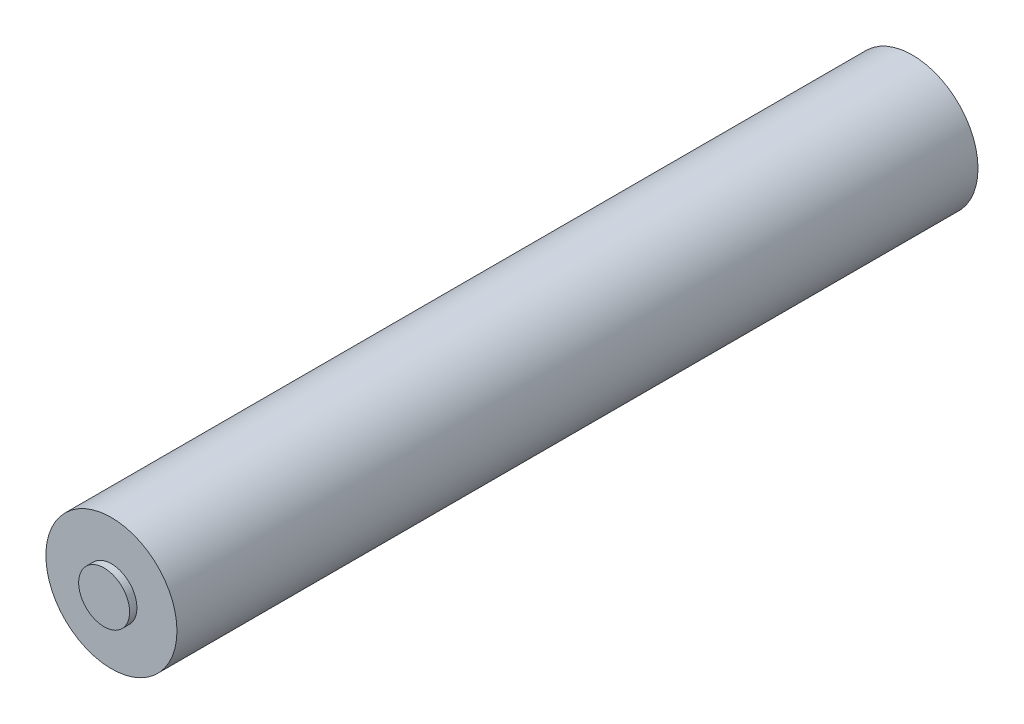
ISO-10303-21;
HEADER;
FILE_DESCRIPTION(('STEP AP214'),'2;1');
FILE_NAME('part.step','',(''),(''),'','','');
FILE_SCHEMA(('AUTOMOTIVE_DESIGN { 1 0 10303 214 1 1 1 1 }'));
ENDSEC;
DATA;
#1=APPLICATION_CONTEXT('core data for automotive mechanical design processes');
#2=APPLICATION_PROTOCOL_DEFINITION('international standard','automotive_design',2000,#1);
#3=PRODUCT_CONTEXT('',#1,'mechanical');
#4=PRODUCT('Part','Part','',(#3));
#5=PRODUCT_RELATED_PRODUCT_CATEGORY('part','',(#4));
#6=PRODUCT_DEFINITION_FORMATION('','',#4);
#7=PRODUCT_DEFINITION_CONTEXT('part definition',#1,'design');
#8=PRODUCT_DEFINITION('design','',#6,#7);
#9=PRODUCT_DEFINITION_SHAPE('','',#8);
#10=(LENGTH_UNIT() NAMED_UNIT(*) SI_UNIT(.MILLI.,.METRE.));
#11=(NAMED_UNIT(*) PLANE_ANGLE_UNIT() SI_UNIT($,.RADIAN.));
#12=(NAMED_UNIT(*) SI_UNIT($,.STERADIAN.) SOLID_ANGLE_UNIT());
#13=UNCERTAINTY_MEASURE_WITH_UNIT(LENGTH_MEASURE(1.E-05),#10,'distance_accuracy_value','');
#14=(GEOMETRIC_REPRESENTATION_CONTEXT(3) GLOBAL_UNCERTAINTY_ASSIGNED_CONTEXT((#13)) GLOBAL_UNIT_ASSIGNED_CONTEXT((#10,
#11,#12)) REPRESENTATION_CONTEXT('',''));
#15=CARTESIAN_POINT('',(0.,0.,0.));
#16=DIRECTION('',(0.,0.,1.));
#17=DIRECTION('',(1.,0.,0.));
#18=AXIS2_PLACEMENT_3D('',#15,#16,#17);
#19=CARTESIAN_POINT('',(127.5,504.39,568.72));
#20=DIRECTION('',(0.,0.,1.));
#21=DIRECTION('',(1.,0.,0.));
#22=AXIS2_PLACEMENT_3D('',#19,#20,#21);
#23=PLANE('',#22);
#24=CARTESIAN_POINT('',(127.5,504.39,568.72));
#25=DIRECTION('',(0.,0.,1.));
#26=DIRECTION('',(1.,0.,0.));
#27=AXIS2_PLACEMENT_3D('',#24,#25,#26);
#28=CIRCLE('',#27,3.5);
#29=CARTESIAN_POINT('',(131.,504.39,568.72));
#30=VERTEX_POINT('',#29);
#31=EDGE_CURVE('E9',#30,#30,#28,.T.);
#32=ORIENTED_EDGE('',*,*,#31,.T.);
#33=EDGE_LOOP('',(#32));
#34=FACE_BOUND('',#33,.T.);
#35=ADVANCED_FACE('F15',(#34),#23,.T.);
#36=CARTESIAN_POINT('',(127.5,504.39,567.72));
#37=DIRECTION('',(0.,0.,-1.));
#38=DIRECTION('',(1.,0.,0.));
#39=AXIS2_PLACEMENT_3D('',#36,#37,#38);
#40=CYLINDRICAL_SURFACE('',#39,3.5);
#41=CARTESIAN_POINT('',(127.5,504.39,567.72));
#42=DIRECTION('',(0.,0.,1.));
#43=DIRECTION('',(1.,0.,0.));
#44=AXIS2_PLACEMENT_3D('',#41,#42,#43);
#45=CIRCLE('',#44,3.5);
#46=CARTESIAN_POINT('',(131.,504.39,567.72));
#47=VERTEX_POINT('',#46);
#48=EDGE_CURVE('E61',#47,#47,#45,.T.);
#49=ORIENTED_EDGE('',*,*,#48,.T.);
#50=DIRECTION('',(0.,0.,1.));
#51=VECTOR('',#50,1.);
#52=CARTESIAN_POINT('',(131.,504.39,567.72));
#53=LINE('',#52,#51);
#54=EDGE_CURVE('E23',#47,#30,#53,.T.);
#55=ORIENTED_EDGE('',*,*,#54,.T.);
#56=ORIENTED_EDGE('',*,*,#31,.F.);
#57=ORIENTED_EDGE('',*,*,#54,.F.);
#58=EDGE_LOOP('',(#49,#55,#56,#57));
#59=FACE_BOUND('',#58,.T.);
#60=ADVANCED_FACE('F68',(#59),#40,.T.);
#61=CARTESIAN_POINT('',(127.5,504.39,567.72));
#62=DIRECTION('',(0.,0.,1.));
#63=DIRECTION('',(1.,0.,0.));
#64=AXIS2_PLACEMENT_3D('',#61,#62,#63);
#65=PLANE('',#64);
#66=ORIENTED_EDGE('',*,*,#48,.F.);
#67=EDGE_LOOP('',(#66));
#68=FACE_BOUND('',#67,.T.);
#69=CARTESIAN_POINT('',(127.5,504.39,567.72));
#70=DIRECTION('',(0.,0.,1.));
#71=DIRECTION('',(1.,0.,0.));
#72=AXIS2_PLACEMENT_3D('',#69,#70,#71);
#73=CIRCLE('',#72,9.);
#74=CARTESIAN_POINT('',(136.5,504.39,567.72));
#75=VERTEX_POINT('',#74);
#76=EDGE_CURVE('E55',#75,#75,#73,.T.);
#77=ORIENTED_EDGE('',*,*,#76,.T.);
#78=EDGE_LOOP('',(#77));
#79=FACE_BOUND('',#78,.T.);
#80=ADVANCED_FACE('F71',(#68,#79),#65,.T.);
#81=CARTESIAN_POINT('',(127.5,504.39,457.72));
#82=DIRECTION('',(0.,0.,1.));
#83=DIRECTION('',(1.,0.,0.));
#84=AXIS2_PLACEMENT_3D('',#81,#82,#83);
#85=PLANE('',#84);
#86=CARTESIAN_POINT('',(127.5,504.39,457.72));
#87=DIRECTION('',(0.,0.,1.));
#88=DIRECTION('',(1.,0.,0.));
#89=AXIS2_PLACEMENT_3D('',#86,#87,#88);
#90=CIRCLE('',#89,9.);
#91=CARTESIAN_POINT('',(136.5,504.39,457.72));
#92=VERTEX_POINT('',#91);
#93=EDGE_CURVE('E54',#92,#92,#90,.T.);
#94=ORIENTED_EDGE('',*,*,#93,.F.);
#95=EDGE_LOOP('',(#94));
#96=FACE_BOUND('',#95,.T.);
#97=ADVANCED_FACE('F74',(#96),#85,.F.);
#98=CARTESIAN_POINT('',(127.5,504.39,457.72));
#99=DIRECTION('',(0.,0.,-1.));
#100=DIRECTION('',(1.,0.,0.));
#101=AXIS2_PLACEMENT_3D('',#98,#99,#100);
#102=CYLINDRICAL_SURFACE('',#101,9.);
#103=ORIENTED_EDGE('',*,*,#93,.T.);
#104=DIRECTION('',(0.,0.,1.));
#105=VECTOR('',#104,1.);
#106=CARTESIAN_POINT('',(136.5,504.39,457.72));
#107=LINE('',#106,#105);
#108=EDGE_CURVE('E51',#92,#75,#107,.T.);
#109=ORIENTED_EDGE('',*,*,#108,.T.);
#110=ORIENTED_EDGE('',*,*,#76,.F.);
#111=ORIENTED_EDGE('',*,*,#108,.F.);
#112=EDGE_LOOP('',(#103,#109,#110,#111));
#113=FACE_BOUND('',#112,.T.);
#114=ADVANCED_FACE('F52',(#113),#102,.T.);
#115=CLOSED_SHELL('',(#35,#60,#80,#97,#114));
#116=MANIFOLD_SOLID_BREP('B1',#115);
#117=ADVANCED_BREP_SHAPE_REPRESENTATION('',(#18,#116),#14);
#118=SHAPE_DEFINITION_REPRESENTATION(#9,#117);
ENDSEC;
END-ISO-10303-21;
